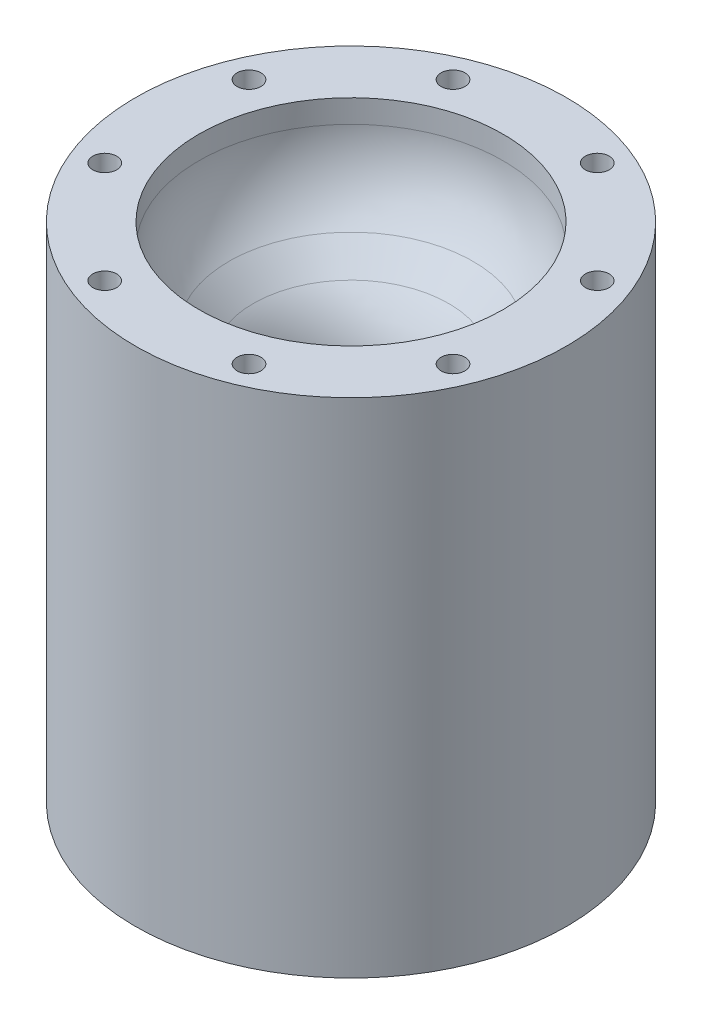
ISO-10303-21;
HEADER;
FILE_DESCRIPTION(('STEP AP214'),'2;1');
FILE_NAME('part.step','',(''),(''),'','','');
FILE_SCHEMA(('AUTOMOTIVE_DESIGN { 1 0 10303 214 1 1 1 1 }'));
ENDSEC;
DATA;
#1=APPLICATION_CONTEXT('core data for automotive mechanical design processes');
#2=APPLICATION_PROTOCOL_DEFINITION('international standard','automotive_design',2000,#1);
#3=PRODUCT_CONTEXT('',#1,'mechanical');
#4=PRODUCT('Part','Part','',(#3));
#5=PRODUCT_RELATED_PRODUCT_CATEGORY('part','',(#4));
#6=PRODUCT_DEFINITION_FORMATION('','',#4);
#7=PRODUCT_DEFINITION_CONTEXT('part definition',#1,'design');
#8=PRODUCT_DEFINITION('design','',#6,#7);
#9=PRODUCT_DEFINITION_SHAPE('','',#8);
#10=(LENGTH_UNIT() NAMED_UNIT(*) SI_UNIT(.MILLI.,.METRE.));
#11=(NAMED_UNIT(*) PLANE_ANGLE_UNIT() SI_UNIT($,.RADIAN.));
#12=(NAMED_UNIT(*) SI_UNIT($,.STERADIAN.) SOLID_ANGLE_UNIT());
#13=UNCERTAINTY_MEASURE_WITH_UNIT(LENGTH_MEASURE(1.E-05),#10,'distance_accuracy_value','');
#14=(GEOMETRIC_REPRESENTATION_CONTEXT(3) GLOBAL_UNCERTAINTY_ASSIGNED_CONTEXT((#13)) GLOBAL_UNIT_ASSIGNED_CONTEXT((#10,
#11,#12)) REPRESENTATION_CONTEXT('',''));
#15=CARTESIAN_POINT('',(0.,0.,0.));
#16=DIRECTION('',(0.,0.,1.));
#17=DIRECTION('',(1.,0.,0.));
#18=AXIS2_PLACEMENT_3D('',#15,#16,#17);
#19=CARTESIAN_POINT('',(-105.474898553049,0.,22.1235140794585));
#20=DIRECTION('',(0.,1.,0.));
#21=DIRECTION('',(-0.546944138603989,0.,0.837169104331222));
#22=AXIS2_PLACEMENT_3D('',#19,#20,#21);
#23=PLANE('',#22);
#24=CARTESIAN_POINT('',(25.5154178529435,0.,61.5996678301896));
#25=DIRECTION('',(0.,1.,0.));
#26=DIRECTION('',(0.,0.,1.));
#27=AXIS2_PLACEMENT_3D('',#24,#25,#26);
#28=CIRCLE('',#27,4.21639999999999);
#29=CARTESIAN_POINT('',(25.5154178529435,0.,65.8160678301896));
#30=VERTEX_POINT('',#29);
#31=EDGE_CURVE('E85',#30,#30,#28,.T.);
#32=ORIENTED_EDGE('',*,*,#31,.F.);
#33=EDGE_LOOP('',(#32));
#34=FACE_BOUND('',#33,.T.);
#35=CARTESIAN_POINT('',(-25.5154178529413,0.,61.5996678301905));
#36=DIRECTION('',(0.,1.,0.));
#37=DIRECTION('',(0.,0.,1.));
#38=AXIS2_PLACEMENT_3D('',#35,#36,#37);
#39=CIRCLE('',#38,4.21639999999999);
#40=CARTESIAN_POINT('',(-25.5154178529413,0.,65.8160678301905));
#41=VERTEX_POINT('',#40);
#42=EDGE_CURVE('E84',#41,#41,#39,.T.);
#43=ORIENTED_EDGE('',*,*,#42,.F.);
#44=EDGE_LOOP('',(#43));
#45=FACE_BOUND('',#44,.T.);
#46=CARTESIAN_POINT('',(-61.5996678301897,0.,25.5154178529433));
#47=DIRECTION('',(0.,1.,0.));
#48=DIRECTION('',(0.,0.,1.));
#49=AXIS2_PLACEMENT_3D('',#46,#47,#48);
#50=CIRCLE('',#49,4.21639999999999);
#51=CARTESIAN_POINT('',(-61.5996678301897,0.,29.7318178529433));
#52=VERTEX_POINT('',#51);
#53=EDGE_CURVE('E95',#52,#52,#50,.T.);
#54=ORIENTED_EDGE('',*,*,#53,.F.);
#55=EDGE_LOOP('',(#54));
#56=FACE_BOUND('',#55,.T.);
#57=CARTESIAN_POINT('',(-61.5996678301902,0.,-25.515417852942));
#58=DIRECTION('',(0.,1.,0.));
#59=DIRECTION('',(0.,0.,1.));
#60=AXIS2_PLACEMENT_3D('',#57,#58,#59);
#61=CIRCLE('',#60,4.21639999999999);
#62=CARTESIAN_POINT('',(-61.5996678301902,0.,-21.299017852942));
#63=VERTEX_POINT('',#62);
#64=EDGE_CURVE('E101',#63,#63,#61,.T.);
#65=ORIENTED_EDGE('',*,*,#64,.F.);
#66=EDGE_LOOP('',(#65));
#67=FACE_BOUND('',#66,.T.);
#68=CARTESIAN_POINT('',(-25.5154178529431,0.,-61.5996678301897));
#69=DIRECTION('',(0.,1.,0.));
#70=DIRECTION('',(0.,0.,1.));
#71=AXIS2_PLACEMENT_3D('',#68,#69,#70);
#72=CIRCLE('',#71,4.21639999999999);
#73=CARTESIAN_POINT('',(-25.5154178529431,0.,-57.3832678301897));
#74=VERTEX_POINT('',#73);
#75=EDGE_CURVE('E107',#74,#74,#72,.T.);
#76=ORIENTED_EDGE('',*,*,#75,.F.);
#77=EDGE_LOOP('',(#76));
#78=FACE_BOUND('',#77,.T.);
#79=CARTESIAN_POINT('',(25.5154178529418,0.,-61.5996678301903));
#80=DIRECTION('',(0.,1.,0.));
#81=DIRECTION('',(0.,0.,1.));
#82=AXIS2_PLACEMENT_3D('',#79,#80,#81);
#83=CIRCLE('',#82,4.21639999999999);
#84=CARTESIAN_POINT('',(25.5154178529418,0.,-57.3832678301903));
#85=VERTEX_POINT('',#84);
#86=EDGE_CURVE('E113',#85,#85,#83,.T.);
#87=ORIENTED_EDGE('',*,*,#86,.F.);
#88=EDGE_LOOP('',(#87));
#89=FACE_BOUND('',#88,.T.);
#90=CARTESIAN_POINT('',(61.5996678301898,0.,-25.5154178529429));
#91=DIRECTION('',(0.,1.,0.));
#92=DIRECTION('',(0.,0.,1.));
#93=AXIS2_PLACEMENT_3D('',#90,#91,#92);
#94=CIRCLE('',#93,4.21639999999999);
#95=CARTESIAN_POINT('',(61.5996678301898,0.,-21.2990178529429));
#96=VERTEX_POINT('',#95);
#97=EDGE_CURVE('E119',#96,#96,#94,.T.);
#98=ORIENTED_EDGE('',*,*,#97,.F.);
#99=EDGE_LOOP('',(#98));
#100=FACE_BOUND('',#99,.T.);
#101=CARTESIAN_POINT('',(61.5996678301902,0.,25.515417852942));
#102=DIRECTION('',(0.,1.,0.));
#103=DIRECTION('',(0.,0.,1.));
#104=AXIS2_PLACEMENT_3D('',#101,#102,#103);
#105=CIRCLE('',#104,4.21639999999999);
#106=CARTESIAN_POINT('',(61.5996678301902,0.,29.731817852942));
#107=VERTEX_POINT('',#106);
#108=EDGE_CURVE('E125',#107,#107,#105,.T.);
#109=ORIENTED_EDGE('',*,*,#108,.F.);
#110=EDGE_LOOP('',(#109));
#111=FACE_BOUND('',#110,.T.);
#112=CARTESIAN_POINT('',(0.,0.,0.));
#113=DIRECTION('',(0.,1.,0.));
#114=DIRECTION('',(-0.546944138603989,0.,0.837169104331222));
#115=AXIS2_PLACEMENT_3D('',#112,#113,#114);
#116=CIRCLE('',#115,53.7924602426016);
#117=CARTESIAN_POINT('',(-29.421470830779,0.,45.0333857610717));
#118=VERTEX_POINT('',#117);
#119=EDGE_CURVE('E135',#118,#118,#116,.F.);
#120=ORIENTED_EDGE('',*,*,#119,.T.);
#121=EDGE_LOOP('',(#120));
#122=FACE_BOUND('',#121,.T.);
#123=CARTESIAN_POINT('',(0.,0.,0.));
#124=DIRECTION('',(0.,1.,0.));
#125=DIRECTION('',(-0.546944138603989,0.,0.837169104331222));
#126=AXIS2_PLACEMENT_3D('',#123,#124,#125);
#127=CIRCLE('',#126,76.2);
#128=CARTESIAN_POINT('',(-41.6771433616239,0.,63.7922857500391));
#129=VERTEX_POINT('',#128);
#130=EDGE_CURVE('E43',#129,#129,#127,.T.);
#131=ORIENTED_EDGE('',*,*,#130,.T.);
#132=EDGE_LOOP('',(#131));
#133=FACE_BOUND('',#132,.T.);
#134=ADVANCED_FACE('F39',(#34,#45,#56,#67,#78,#89,#100,#111,#122,#133),#23,.T.);
#135=CARTESIAN_POINT('',(0.,-67.8726529233654,0.));
#136=DIRECTION('',(0.,-1.,0.));
#137=DIRECTION('',(0.546944138603989,0.,-0.837169104331222));
#138=AXIS2_PLACEMENT_3D('',#135,#136,#137);
#139=CYLINDRICAL_SURFACE('',#138,53.7924602426016);
#140=CARTESIAN_POINT('',(0.,-8.14497921746751,0.));
#141=DIRECTION('',(0.,-1.,0.));
#142=DIRECTION('',(0.546944138603989,0.,-0.837169104331222));
#143=AXIS2_PLACEMENT_3D('',#140,#141,#142);
#144=CIRCLE('',#143,53.7924602426016);
#145=CARTESIAN_POINT('',(29.421470830779,-8.14497921746751,-45.0333857610717));
#146=VERTEX_POINT('',#145);
#147=EDGE_CURVE('E141',#146,#146,#144,.T.);
#148=ORIENTED_EDGE('',*,*,#147,.T.);
#149=EDGE_LOOP('',(#148));
#150=FACE_BOUND('',#149,.T.);
#151=ORIENTED_EDGE('',*,*,#119,.F.);
#152=EDGE_LOOP('',(#151));
#153=FACE_BOUND('',#152,.T.);
#154=ADVANCED_FACE('F41',(#150,#153),#139,.F.);
#155=CARTESIAN_POINT('',(0.,-67.8726529233654,0.));
#156=DIRECTION('',(0.,-1.,0.));
#157=DIRECTION('',(0.546944138603989,0.,-0.837169104331222));
#158=AXIS2_PLACEMENT_3D('',#155,#156,#157);
#159=CYLINDRICAL_SURFACE('',#158,76.2);
#160=CARTESIAN_POINT('',(0.,-177.8,0.));
#161=DIRECTION('',(0.,-1.,0.));
#162=DIRECTION('',(0.546944138603989,0.,-0.837169104331222));
#163=AXIS2_PLACEMENT_3D('',#160,#161,#162);
#164=CIRCLE('',#163,76.2);
#165=CARTESIAN_POINT('',(41.6771433616239,-177.8,-63.7922857500391));
#166=VERTEX_POINT('',#165);
#167=EDGE_CURVE('E144',#166,#166,#164,.T.);
#168=ORIENTED_EDGE('',*,*,#167,.F.);
#169=EDGE_LOOP('',(#168));
#170=FACE_BOUND('',#169,.T.);
#171=ORIENTED_EDGE('',*,*,#130,.F.);
#172=EDGE_LOOP('',(#171));
#173=FACE_BOUND('',#172,.T.);
#174=ADVANCED_FACE('F171',(#170,#173),#159,.T.);
#175=CARTESIAN_POINT('',(22.3576150181326,-74.3818925737037,14.6068057505548));
#176=CARTESIAN_POINT('',(22.3151212001886,-74.3311317646138,14.5790434447899));
#177=CARTESIAN_POINT('',(22.2531052276855,-74.2547747023861,14.5385268126245));
#178=CARTESIAN_POINT('',(22.1142299052263,-74.081294569482,14.4477959874868));
#179=CARTESIAN_POINT('',(21.9985251885419,-73.9226045599318,14.372203115901));
#180=CARTESIAN_POINT('',(21.8415816142479,-73.7055665706629,14.2696678364603));
#181=CARTESIAN_POINT('',(21.6955199673253,-73.4833804661312,14.1742420004544));
#182=CARTESIAN_POINT('',(21.5175234127509,-73.198171859299,14.0579522667405));
#183=CARTESIAN_POINT('',(21.3590694452682,-72.9183567845891,13.9544302085269));
#184=CARTESIAN_POINT('',(21.2033340442785,-72.6239544988483,13.8526842598245));
#185=CARTESIAN_POINT('',(21.0606165679029,-72.327436046122,13.7594432565719));
#186=CARTESIAN_POINT('',(20.9250437941573,-72.0219351077,13.6708700715716));
#187=CARTESIAN_POINT('',(20.8004861551113,-71.7123196560876,13.5894933577845));
#188=CARTESIAN_POINT('',(20.6848821385096,-71.3962800805611,13.5139662761563));
#189=CARTESIAN_POINT('',(20.5797523673591,-71.0759999643649,13.4452822888639));
#190=CARTESIAN_POINT('',(20.484417510876,-70.7507455680926,13.3829975716086));
#191=CARTESIAN_POINT('',(20.3995136270642,-70.4218923440607,13.3275276774674));
#192=CARTESIAN_POINT('',(20.3248532371523,-70.0890073433412,13.2787501217299));
#193=CARTESIAN_POINT('',(20.2607278419163,-69.7536497003092,13.2368553493613));
#194=CARTESIAN_POINT('',(20.2071118522122,-69.414703421174,13.2018266423147));
#195=CARTESIAN_POINT('',(20.1641528657746,-69.075190196234,13.1737604299917));
#196=CARTESIAN_POINT('',(20.1358987167878,-68.7740862512058,13.1553012667239));
#197=CARTESIAN_POINT('',(20.1184006365342,-68.519417189635,13.1438693202008));
#198=CARTESIAN_POINT('',(20.1082943052423,-68.2997170404591,13.1372665936617));
#199=CARTESIAN_POINT('',(20.10290474022,-68.1402939927496,13.133745452015));
#200=CARTESIAN_POINT('',(20.1008809748885,-67.9827666128845,13.1324232739983));
#201=CARTESIAN_POINT('',(20.1004307194324,-67.9085455755414,13.1321291105118));
#202=CARTESIAN_POINT('',(20.1004301949926,-67.8726529233655,13.1321287678818));
#203=B_SPLINE_CURVE_WITH_KNOTS('',4,(#175,#176,#177,#178,#179,#180,#181,#182,#183,#184,#185,
#186,#187,#188,#189,#190,#191,#192,#193,#194,#195,#196,#197,#198,#199,#200,#201,#202),
.UNSPECIFIED.,.F.,.F.,(5,1,1,1,1,1,1,1,1,1,1,1,1,1,1,1,1,1,1,1,1,1,1,1,5),(0.0825688161645696,
0.122284452541055,0.142142270729318,0.162000088917581,0.201715725294151,0.241431361670644,
0.281146998047181,0.320862634423759,0.360578270800262,0.400293907176806,0.440009543553384,
0.479725179929891,0.519440816306429,0.55915645268299,0.598872089059496,0.638587725436031,
0.678303361812587,0.718018998189109,0.75773463456565,0.797450270942201,0.837165907318734,
0.857023725507005,0.876881543695275,0.896739361883545,0.916597180071815),.UNSPECIFIED.);
#204=CARTESIAN_POINT('',(0.,-67.8726529233654,0.));
#205=DIRECTION('',(0.,-1.,0.));
#206=AXIS1_PLACEMENT('',#204,#205);
#207=SURFACE_OF_REVOLUTION('',#203,#206);
#208=CARTESIAN_POINT('',(0.,-67.8726529186409,0.));
#209=DIRECTION('',(0.,-1.,0.));
#210=DIRECTION('',(0.546944138603989,0.,-0.837169104331222));
#211=AXIS2_PLACEMENT_3D('',#208,#209,#210);
#212=CIRCLE('',#211,24.0100000000001);
#213=CARTESIAN_POINT('',(13.1321287678818,-67.8726529186409,-20.1004301949927));
#214=VERTEX_POINT('',#213);
#215=EDGE_CURVE('E131',#214,#214,#212,.T.);
#216=ORIENTED_EDGE('',*,*,#215,.F.);
#217=EDGE_LOOP('',(#216));
#218=FACE_BOUND('',#217,.T.);
#219=CARTESIAN_POINT('',(0.,-74.3818925737037,0.));
#220=DIRECTION('',(0.,-1.,0.));
#221=DIRECTION('',(0.546944138603989,0.,-0.837169104331222));
#222=AXIS2_PLACEMENT_3D('',#219,#220,#221);
#223=CIRCLE('',#222,26.7062113287053);
#224=CARTESIAN_POINT('',(14.6068057505548,-74.3818925737037,-22.3576150181326));
#225=VERTEX_POINT('',#224);
#226=EDGE_CURVE('E11',#225,#225,#223,.T.);
#227=ORIENTED_EDGE('',*,*,#226,.T.);
#228=EDGE_LOOP('',(#227));
#229=FACE_BOUND('',#228,.T.);
#230=ADVANCED_FACE('F173',(#218,#229),#207,.T.);
#231=CARTESIAN_POINT('',(20.1004301949927,-67.8726529186409,13.1321287678818));
#232=CARTESIAN_POINT('',(20.1004312254771,-67.8021242760988,13.1321294411238));
#233=CARTESIAN_POINT('',(20.1008742114858,-67.6590687334712,13.1324188552931));
#234=CARTESIAN_POINT('',(20.1028630625336,-67.3294700072802,13.133718222909));
#235=CARTESIAN_POINT('',(20.1081576506364,-67.0484925265606,13.1371773136879));
#236=CARTESIAN_POINT('',(20.1160983018644,-66.6778308516662,13.1423651456604));
#237=CARTESIAN_POINT('',(20.1266820395964,-66.3592178650873,13.1492797741233));
#238=CARTESIAN_POINT('',(20.1399094997414,-66.0107133201954,13.1579216145322));
#239=CARTESIAN_POINT('',(20.1557782573347,-65.6789460516852,13.1682890825953));
#240=CARTESIAN_POINT('',(20.178915615045,-65.254583523584,13.1834053143303));
#241=CARTESIAN_POINT('',(20.2119571795456,-64.750618976727,13.2049922194614));
#242=CARTESIAN_POINT('',(20.2714067866383,-63.9926742486808,13.243832179003));
#243=CARTESIAN_POINT('',(20.3717222273905,-62.9862025355214,13.3093708402448));
#244=CARTESIAN_POINT('',(20.5193648430517,-61.8159421635176,13.4058295638483));
#245=CARTESIAN_POINT('',(20.7298284807685,-60.4874865093139,13.5433308792252));
#246=CARTESIAN_POINT('',(20.9817411069935,-59.1690784099242,13.7079118863853));
#247=CARTESIAN_POINT('',(21.2747296275626,-57.8630157161931,13.8993288333013));
#248=CARTESIAN_POINT('',(21.6084171660008,-56.5708333285718,14.1173354968651));
#249=CARTESIAN_POINT('',(21.9822838387625,-55.2945535908105,14.3615922237659));
#250=CARTESIAN_POINT('',(22.3958938779079,-54.0357654423022,14.6318143155845));
#251=CARTESIAN_POINT('',(22.8485259329291,-52.7964557981062,14.9275304954547));
#252=CARTESIAN_POINT('',(23.3397820114652,-51.5780431337703,15.2484807447159));
#253=CARTESIAN_POINT('',(23.8685882605895,-50.3827141343478,15.5939634875923));
#254=CARTESIAN_POINT('',(24.4348435844443,-49.2113651719956,15.963912675556));
#255=CARTESIAN_POINT('',(25.0366950938936,-48.0669095333356,16.3571177684103));
#256=CARTESIAN_POINT('',(25.675100915406,-46.9487928559064,16.7742047348551));
#257=CARTESIAN_POINT('',(26.2620780115252,-45.9982411711718,17.1576919903645));
#258=CARTESIAN_POINT('',(26.7891336713676,-45.1992074516618,17.5020310281735));
#259=CARTESIAN_POINT('',(27.2373475599466,-44.5522307944854,17.7948607061094));
#260=CARTESIAN_POINT('',(27.6125059350549,-44.032647916699,18.0399613354232));
#261=CARTESIAN_POINT('',(27.9776742927726,-43.5428366874424,18.2785352290655));
#262=CARTESIAN_POINT('',(28.3354603568983,-43.084168544351,18.5122860801604));
#263=CARTESIAN_POINT('',(28.5947588528579,-42.7587846242642,18.6816924662539));
#264=CARTESIAN_POINT('',(28.8386273170148,-42.4630038879591,18.8410180151435));
#265=CARTESIAN_POINT('',(28.9219695677308,-42.3627030027853,18.8954676541607));
#266=CARTESIAN_POINT('',(28.9637195073119,-42.312830817846,18.9227439650312));
#267=B_SPLINE_CURVE_WITH_KNOTS('',4,(#231,#232,#233,#234,#235,#236,#237,#238,#239,#240,#241,
#242,#243,#244,#245,#246,#247,#248,#249,#250,#251,#252,#253,#254,#255,#256,#257,#258,#259,#260,
#261,#262,#263,#264,#265,#266),.UNSPECIFIED.,.F.,.F.,(5,1,1,1,1,1,1,1,1,1,1,1,1,1,1,1,1,1,1,1,1,
1,1,1,1,1,1,1,1,1,1,1,5),(0.0826377293508924,0.0925749264345495,0.10251212335078,
0.11244932026701,0.122386517183241,0.132323714099471,0.142260911015702,0.152198107931932,
0.162135304848163,0.182009698680624,0.201884092513085,0.241632880178006,0.281381667842927,
0.321130455507848,0.360879243172768,0.400628030837689,0.44037681850261,0.480125606167531,
0.519874393832452,0.559623181497373,0.599371969162294,0.639120756827214,0.678869544492136,
0.718618332157059,0.758367119821983,0.798115907486907,0.817990301319368,0.837864695151829,
0.857739088984291,0.877613482816753,0.897487876649217,0.907425073565449,0.917362270311961),.UNSPECIFIED.);
#268=CARTESIAN_POINT('',(0.,-67.8726529233654,0.));
#269=DIRECTION('',(0.,-1.,0.));
#270=AXIS1_PLACEMENT('',#268,#269);
#271=SURFACE_OF_REVOLUTION('',#267,#270);
#272=CARTESIAN_POINT('',(0.,-42.3128308211773,0.));
#273=DIRECTION('',(0.,-1.,0.));
#274=DIRECTION('',(0.546944138603989,0.,-0.837169104331222));
#275=AXIS2_PLACEMENT_3D('',#272,#273,#274);
#276=CIRCLE('',#275,34.5972150126512);
#277=CARTESIAN_POINT('',(18.9227439631915,-42.3128308211773,-28.9637195044959));
#278=VERTEX_POINT('',#277);
#279=EDGE_CURVE('E134',#278,#278,#276,.T.);
#280=ORIENTED_EDGE('',*,*,#279,.F.);
#281=EDGE_LOOP('',(#280));
#282=FACE_BOUND('',#281,.T.);
#283=ORIENTED_EDGE('',*,*,#215,.T.);
#284=EDGE_LOOP('',(#283));
#285=FACE_BOUND('',#284,.T.);
#286=ADVANCED_FACE('F179',(#282,#285),#271,.T.);
#287=CARTESIAN_POINT('',(0.,-42.3128308211773,0.));
#288=DIRECTION('',(0.,1.,0.));
#289=DIRECTION('',(-0.546944138603989,0.,0.837169104331222));
#290=AXIS2_PLACEMENT_3D('',#287,#288,#289);
#291=CONICAL_SURFACE('',#290,34.5972150126512,0.785398163436918);
#292=CARTESIAN_POINT('',(0.,-33.7052026337569,0.));
#293=DIRECTION('',(0.,-1.,0.));
#294=DIRECTION('',(0.546944138603989,0.,-0.837169104331222));
#295=AXIS2_PLACEMENT_3D('',#292,#293,#294);
#296=CIRCLE('',#295,43.2048432007511);
#297=CARTESIAN_POINT('',(23.6306357479552,-33.7052026337569,-36.1697598851437));
#298=VERTEX_POINT('',#297);
#299=EDGE_CURVE('E138',#298,#298,#296,.T.);
#300=ORIENTED_EDGE('',*,*,#299,.F.);
#301=EDGE_LOOP('',(#300));
#302=FACE_BOUND('',#301,.T.);
#303=ORIENTED_EDGE('',*,*,#279,.T.);
#304=EDGE_LOOP('',(#303));
#305=FACE_BOUND('',#304,.T.);
#306=ADVANCED_FACE('F206',(#302,#305),#291,.F.);
#307=CARTESIAN_POINT('',(36.1697598851437,-33.7052026337569,23.6306357479552));
#308=CARTESIAN_POINT('',(36.2115113164484,-33.6553302357281,23.6579130334072));
#309=CARTESIAN_POINT('',(36.2957379983243,-33.5539760047141,23.7129404940812));
#310=CARTESIAN_POINT('',(36.4880192805099,-33.3209428448882,23.8385628082715));
#311=CARTESIAN_POINT('',(36.6553293851741,-33.1121521474801,23.947870809011));
#312=CARTESIAN_POINT('',(36.912786413702,-32.7878611179685,24.1160741170012));
#313=CARTESIAN_POINT('',(37.1918305246546,-32.4254996507945,24.2983808219523));
#314=CARTESIAN_POINT('',(37.5269918159564,-31.9782446811994,24.517350326221));
#315=CARTESIAN_POINT('',(37.8934129805481,-31.4691110381062,24.7567427108623));
#316=CARTESIAN_POINT('',(38.3460872815335,-30.8168202055752,25.0524864911089));
#317=CARTESIAN_POINT('',(38.8704323565649,-30.021040552137,25.3950546340451));
#318=CARTESIAN_POINT('',(39.4591573739396,-29.0684161083598,25.7796838515314));
#319=CARTESIAN_POINT('',(40.0965556595241,-27.9515197014156,26.1961125688038));
#320=CARTESIAN_POINT('',(40.6990241759653,-26.8063374901098,26.5897207682179));
#321=CARTESIAN_POINT('',(41.2649463203899,-25.635399139947,26.9594522814783));
#322=CARTESIAN_POINT('',(41.7939875624346,-24.439790862229,27.3050885512822));
#323=CARTESIAN_POINT('',(42.2851319406022,-23.2215235930892,27.6259658238156));
#324=CARTESIAN_POINT('',(42.7378617962801,-21.9820839991571,27.9217458993738));
#325=CARTESIAN_POINT('',(43.1514379745436,-20.7233573446488,28.1919458690062));
#326=CARTESIAN_POINT('',(43.4786128062074,-19.6065231937962,28.4056976134882));
#327=CARTESIAN_POINT('',(43.7338996678895,-18.6394146816749,28.5724830955816));
#328=CARTESIAN_POINT('',(43.9689138795066,-17.6650033877727,28.7260239332303));
#329=CARTESIAN_POINT('',(44.1835313131354,-16.6839533463177,28.8662390304648));
#330=CARTESIAN_POINT('',(44.3724712389804,-15.6950496116773,28.9896783504953));
#331=CARTESIAN_POINT('',(44.5355071173688,-14.700067196054,29.0961938891187));
#332=CARTESIAN_POINT('',(44.6777128294519,-13.7000570080899,29.1891005435777));
#333=CARTESIAN_POINT('',(44.7788019090098,-12.8643265797087,29.2551446429777));
#334=CARTESIAN_POINT('',(44.8624029574195,-12.024012075744,29.309763361194));
#335=CARTESIAN_POINT('',(44.9284595193324,-11.1844942775343,29.3529198144932));
#336=CARTESIAN_POINT('',(44.9654725836544,-10.5915325442142,29.3771014027505));
#337=CARTESIAN_POINT('',(44.9905979943656,-10.0908980011361,29.3935164807167));
#338=CARTESIAN_POINT('',(45.0071327824356,-9.65965482234239,29.4043190836451));
#339=CARTESIAN_POINT('',(45.0177170295639,-9.33992495659441,29.4112340449096));
#340=CARTESIAN_POINT('',(45.0256579908264,-8.967696951742,29.4164220794357));
#341=CARTESIAN_POINT('',(45.0309527529677,-8.69092782805737,29.4198812839184));
#342=CARTESIAN_POINT('',(45.0329417454924,-8.35708634162131,29.4211807439647));
#343=CARTESIAN_POINT('',(45.0333847293643,-8.2155092879735,29.4214701567381));
#344=CARTESIAN_POINT('',(45.0333857610714,-8.1449792347959,29.4214708307789));
#345=B_SPLINE_CURVE_WITH_KNOTS('',4,(#307,#308,#309,#310,#311,#312,#313,#314,#315,#316,#317,
#318,#319,#320,#321,#322,#323,#324,#325,#326,#327,#328,#329,#330,#331,#332,#333,#334,#335,#336,
#337,#338,#339,#340,#341,#342,#343,#344),.UNSPECIFIED.,.F.,.F.,(5,1,1,1,1,1,1,1,1,1,1,1,1,1,1,1,
1,1,1,1,1,1,1,1,1,1,1,1,1,1,1,1,1,1,5),(0.0826377289041388,0.0925749252106824,0.102512122126915,
0.112449319043147,0.122386515959379,0.14226090979184,0.162135303624301,0.182009697456762,
0.201884091289222,0.241632878954144,0.281381666619066,0.321130454283987,0.360879241948909,
0.400628029613831,0.440376817278752,0.480125604943674,0.519874392608595,0.559623180273516,
0.599371967938437,0.619246361770898,0.639120755603359,0.678869543268281,0.718618330933202,
0.738492724765663,0.758367118598124,0.798115906263045,0.817990300095506,0.837864693927966,
0.857739087760428,0.867676284676658,0.877613481592889,0.887550678509119,0.897487875425349,
0.90742507234158,0.917362269871989),.UNSPECIFIED.);
#346=CARTESIAN_POINT('',(0.,-67.8726529233654,0.));
#347=DIRECTION('',(0.,-1.,0.));
#348=AXIS1_PLACEMENT('',#346,#347);
#349=SURFACE_OF_REVOLUTION('',#345,#348);
#350=ORIENTED_EDGE('',*,*,#147,.F.);
#351=EDGE_LOOP('',(#350));
#352=FACE_BOUND('',#351,.T.);
#353=ORIENTED_EDGE('',*,*,#299,.T.);
#354=EDGE_LOOP('',(#353));
#355=FACE_BOUND('',#354,.T.);
#356=ADVANCED_FACE('F209',(#352,#355),#349,.T.);
#357=CARTESIAN_POINT('',(59.9735016088269,-177.8,39.1822333227514));
#358=DIRECTION('',(0.,1.,0.));
#359=DIRECTION('',(-0.546944138603989,0.,0.837169104331222));
#360=AXIS2_PLACEMENT_3D('',#357,#358,#359);
#361=PLANE('',#360);
#362=CARTESIAN_POINT('',(0.,-177.8,0.));
#363=DIRECTION('',(0.,-1.,0.));
#364=DIRECTION('',(0.546944138603989,0.,-0.837169104331222));
#365=AXIS2_PLACEMENT_3D('',#362,#363,#364);
#366=CIRCLE('',#365,71.6384554787615);
#367=CARTESIAN_POINT('',(39.1822333227514,-177.8,-59.9735016088269));
#368=VERTEX_POINT('',#367);
#369=EDGE_CURVE('E48',#368,#368,#366,.T.);
#370=ORIENTED_EDGE('',*,*,#369,.F.);
#371=EDGE_LOOP('',(#370));
#372=FACE_BOUND('',#371,.T.);
#373=ORIENTED_EDGE('',*,*,#167,.T.);
#374=EDGE_LOOP('',(#373));
#375=FACE_BOUND('',#374,.T.);
#376=ADVANCED_FACE('F166',(#372,#375),#361,.F.);
#377=CARTESIAN_POINT('',(59.9735016088269,-177.8,39.1822333227514));
#378=CARTESIAN_POINT('',(41.1655583611938,-102.508607147064,26.8945195678259));
#379=CARTESIAN_POINT('',(22.3576150181326,-74.3818925737037,14.6068057505548));
#380=B_SPLINE_CURVE_WITH_KNOTS('',2,(#377,#378,#379),.UNSPECIFIED.,.F.,.F.,(3,3),(0.,1.),.UNSPECIFIED.);
#381=CARTESIAN_POINT('',(0.,-67.8726529233654,0.));
#382=DIRECTION('',(0.,-1.,0.));
#383=AXIS1_PLACEMENT('',#381,#382);
#384=SURFACE_OF_REVOLUTION('',#380,#383);
#385=ORIENTED_EDGE('',*,*,#226,.F.);
#386=EDGE_LOOP('',(#385));
#387=FACE_BOUND('',#386,.T.);
#388=ORIENTED_EDGE('',*,*,#369,.T.);
#389=EDGE_LOOP('',(#388));
#390=FACE_BOUND('',#389,.T.);
#391=ADVANCED_FACE('F161',(#387,#390),#384,.T.);
#392=CARTESIAN_POINT('',(61.5996678301902,-22.22754,25.515417852942));
#393=DIRECTION('',(0.,1.,0.));
#394=DIRECTION('',(0.,0.,1.));
#395=AXIS2_PLACEMENT_3D('',#392,#393,#394);
#396=CONICAL_SURFACE('',#395,4.21639999999999,1.02974425867665);
#397=CARTESIAN_POINT('',(61.5996678301902,-24.7610087140678,25.515417852942));
#398=VERTEX_POINT('',#397);
#399=VERTEX_LOOP('',#398);
#400=FACE_BOUND('',#399,.T.);
#401=CARTESIAN_POINT('',(61.5996678301902,-22.22754,25.515417852942));
#402=DIRECTION('',(0.,1.,0.));
#403=DIRECTION('',(0.,0.,1.));
#404=AXIS2_PLACEMENT_3D('',#401,#402,#403);
#405=CIRCLE('',#404,4.21639999999999);
#406=CARTESIAN_POINT('',(61.5996678301902,-22.22754,29.731817852942));
#407=VERTEX_POINT('',#406);
#408=EDGE_CURVE('E128',#407,#407,#405,.T.);
#409=ORIENTED_EDGE('',*,*,#408,.T.);
#410=EDGE_LOOP('',(#409));
#411=FACE_BOUND('',#410,.T.);
#412=ADVANCED_FACE('F165',(#400,#411),#396,.F.);
#413=CARTESIAN_POINT('',(61.5996678301902,0.,25.515417852942));
#414=DIRECTION('',(0.,1.,0.));
#415=DIRECTION('',(0.,0.,1.));
#416=AXIS2_PLACEMENT_3D('',#413,#414,#415);
#417=CYLINDRICAL_SURFACE('',#416,4.21639999999999);
#418=ORIENTED_EDGE('',*,*,#408,.F.);
#419=EDGE_LOOP('',(#418));
#420=FACE_BOUND('',#419,.T.);
#421=ORIENTED_EDGE('',*,*,#108,.T.);
#422=EDGE_LOOP('',(#421));
#423=FACE_BOUND('',#422,.T.);
#424=ADVANCED_FACE('F242',(#420,#423),#417,.F.);
#425=CARTESIAN_POINT('',(61.5996678301898,-22.22754,-25.5154178529429));
#426=DIRECTION('',(0.,1.,0.));
#427=DIRECTION('',(0.,0.,1.));
#428=AXIS2_PLACEMENT_3D('',#425,#426,#427);
#429=CONICAL_SURFACE('',#428,4.21639999999998,1.02974425867665);
#430=CARTESIAN_POINT('',(61.5996678301898,-24.7610087140678,-25.5154178529429));
#431=VERTEX_POINT('',#430);
#432=VERTEX_LOOP('',#431);
#433=FACE_BOUND('',#432,.T.);
#434=CARTESIAN_POINT('',(61.5996678301898,-22.22754,-25.5154178529429));
#435=DIRECTION('',(0.,1.,0.));
#436=DIRECTION('',(0.,0.,1.));
#437=AXIS2_PLACEMENT_3D('',#434,#435,#436);
#438=CIRCLE('',#437,4.21639999999998);
#439=CARTESIAN_POINT('',(61.5996678301898,-22.22754,-21.2990178529429));
#440=VERTEX_POINT('',#439);
#441=EDGE_CURVE('E122',#440,#440,#438,.T.);
#442=ORIENTED_EDGE('',*,*,#441,.T.);
#443=EDGE_LOOP('',(#442));
#444=FACE_BOUND('',#443,.T.);
#445=ADVANCED_FACE('F249',(#433,#444),#429,.F.);
#446=CARTESIAN_POINT('',(61.5996678301898,0.,-25.5154178529429));
#447=DIRECTION('',(0.,1.,0.));
#448=DIRECTION('',(0.,0.,1.));
#449=AXIS2_PLACEMENT_3D('',#446,#447,#448);
#450=CYLINDRICAL_SURFACE('',#449,4.21639999999999);
#451=ORIENTED_EDGE('',*,*,#441,.F.);
#452=EDGE_LOOP('',(#451));
#453=FACE_BOUND('',#452,.T.);
#454=ORIENTED_EDGE('',*,*,#97,.T.);
#455=EDGE_LOOP('',(#454));
#456=FACE_BOUND('',#455,.T.);
#457=ADVANCED_FACE('F258',(#453,#456),#450,.F.);
#458=CARTESIAN_POINT('',(25.5154178529418,-22.22754,-61.5996678301903));
#459=DIRECTION('',(0.,1.,0.));
#460=DIRECTION('',(0.,0.,1.));
#461=AXIS2_PLACEMENT_3D('',#458,#459,#460);
#462=CONICAL_SURFACE('',#461,4.21639999999999,1.02974425867665);
#463=CARTESIAN_POINT('',(25.5154178529417,-24.7610087140678,-61.5996678301903));
#464=VERTEX_POINT('',#463);
#465=VERTEX_LOOP('',#464);
#466=FACE_BOUND('',#465,.T.);
#467=CARTESIAN_POINT('',(25.5154178529418,-22.22754,-61.5996678301903));
#468=DIRECTION('',(0.,1.,0.));
#469=DIRECTION('',(0.,0.,1.));
#470=AXIS2_PLACEMENT_3D('',#467,#468,#469);
#471=CIRCLE('',#470,4.21639999999999);
#472=CARTESIAN_POINT('',(25.5154178529418,-22.22754,-57.3832678301903));
#473=VERTEX_POINT('',#472);
#474=EDGE_CURVE('E116',#473,#473,#471,.T.);
#475=ORIENTED_EDGE('',*,*,#474,.T.);
#476=EDGE_LOOP('',(#475));
#477=FACE_BOUND('',#476,.T.);
#478=ADVANCED_FACE('F267',(#466,#477),#462,.F.);
#479=CARTESIAN_POINT('',(25.5154178529418,0.,-61.5996678301903));
#480=DIRECTION('',(0.,1.,0.));
#481=DIRECTION('',(0.,0.,1.));
#482=AXIS2_PLACEMENT_3D('',#479,#480,#481);
#483=CYLINDRICAL_SURFACE('',#482,4.21639999999999);
#484=ORIENTED_EDGE('',*,*,#474,.F.);
#485=EDGE_LOOP('',(#484));
#486=FACE_BOUND('',#485,.T.);
#487=ORIENTED_EDGE('',*,*,#86,.T.);
#488=EDGE_LOOP('',(#487));
#489=FACE_BOUND('',#488,.T.);
#490=ADVANCED_FACE('F277',(#486,#489),#483,.F.);
#491=CARTESIAN_POINT('',(-25.5154178529431,-22.22754,-61.5996678301897));
#492=DIRECTION('',(0.,1.,0.));
#493=DIRECTION('',(0.,0.,1.));
#494=AXIS2_PLACEMENT_3D('',#491,#492,#493);
#495=CONICAL_SURFACE('',#494,4.21639999999999,1.02974425867665);
#496=CARTESIAN_POINT('',(-25.5154178529431,-24.7610087140678,-61.5996678301897));
#497=VERTEX_POINT('',#496);
#498=VERTEX_LOOP('',#497);
#499=FACE_BOUND('',#498,.T.);
#500=CARTESIAN_POINT('',(-25.5154178529431,-22.22754,-61.5996678301897));
#501=DIRECTION('',(0.,1.,0.));
#502=DIRECTION('',(0.,0.,1.));
#503=AXIS2_PLACEMENT_3D('',#500,#501,#502);
#504=CIRCLE('',#503,4.21639999999999);
#505=CARTESIAN_POINT('',(-25.5154178529431,-22.22754,-57.3832678301898));
#506=VERTEX_POINT('',#505);
#507=EDGE_CURVE('E110',#506,#506,#504,.T.);
#508=ORIENTED_EDGE('',*,*,#507,.T.);
#509=EDGE_LOOP('',(#508));
#510=FACE_BOUND('',#509,.T.);
#511=ADVANCED_FACE('F285',(#499,#510),#495,.F.);
#512=CARTESIAN_POINT('',(-25.5154178529431,0.,-61.5996678301897));
#513=DIRECTION('',(0.,1.,0.));
#514=DIRECTION('',(0.,0.,1.));
#515=AXIS2_PLACEMENT_3D('',#512,#513,#514);
#516=CYLINDRICAL_SURFACE('',#515,4.21639999999999);
#517=ORIENTED_EDGE('',*,*,#507,.F.);
#518=EDGE_LOOP('',(#517));
#519=FACE_BOUND('',#518,.T.);
#520=ORIENTED_EDGE('',*,*,#75,.T.);
#521=EDGE_LOOP('',(#520));
#522=FACE_BOUND('',#521,.T.);
#523=ADVANCED_FACE('F294',(#519,#522),#516,.F.);
#524=CARTESIAN_POINT('',(-61.5996678301902,-22.22754,-25.515417852942));
#525=DIRECTION('',(0.,1.,0.));
#526=DIRECTION('',(0.,0.,1.));
#527=AXIS2_PLACEMENT_3D('',#524,#525,#526);
#528=CONICAL_SURFACE('',#527,4.21639999999999,1.02974425867665);
#529=CARTESIAN_POINT('',(-61.5996678301902,-24.7610087140678,-25.515417852942));
#530=VERTEX_POINT('',#529);
#531=VERTEX_LOOP('',#530);
#532=FACE_BOUND('',#531,.T.);
#533=CARTESIAN_POINT('',(-61.5996678301902,-22.22754,-25.515417852942));
#534=DIRECTION('',(0.,1.,0.));
#535=DIRECTION('',(0.,0.,1.));
#536=AXIS2_PLACEMENT_3D('',#533,#534,#535);
#537=CIRCLE('',#536,4.21639999999999);
#538=CARTESIAN_POINT('',(-61.5996678301902,-22.22754,-21.299017852942));
#539=VERTEX_POINT('',#538);
#540=EDGE_CURVE('E104',#539,#539,#537,.T.);
#541=ORIENTED_EDGE('',*,*,#540,.T.);
#542=EDGE_LOOP('',(#541));
#543=FACE_BOUND('',#542,.T.);
#544=ADVANCED_FACE('F302',(#532,#543),#528,.F.);
#545=CARTESIAN_POINT('',(-61.5996678301902,0.,-25.515417852942));
#546=DIRECTION('',(0.,1.,0.));
#547=DIRECTION('',(0.,0.,1.));
#548=AXIS2_PLACEMENT_3D('',#545,#546,#547);
#549=CYLINDRICAL_SURFACE('',#548,4.21639999999999);
#550=ORIENTED_EDGE('',*,*,#540,.F.);
#551=EDGE_LOOP('',(#550));
#552=FACE_BOUND('',#551,.T.);
#553=ORIENTED_EDGE('',*,*,#64,.T.);
#554=EDGE_LOOP('',(#553));
#555=FACE_BOUND('',#554,.T.);
#556=ADVANCED_FACE('F311',(#552,#555),#549,.F.);
#557=CARTESIAN_POINT('',(-61.5996678301897,-22.22754,25.5154178529433));
#558=DIRECTION('',(0.,1.,0.));
#559=DIRECTION('',(0.,0.,1.));
#560=AXIS2_PLACEMENT_3D('',#557,#558,#559);
#561=CONICAL_SURFACE('',#560,4.21639999999999,1.02974425867665);
#562=CARTESIAN_POINT('',(-61.5996678301897,-24.7610087140678,25.5154178529433));
#563=VERTEX_POINT('',#562);
#564=VERTEX_LOOP('',#563);
#565=FACE_BOUND('',#564,.T.);
#566=CARTESIAN_POINT('',(-61.5996678301897,-22.22754,25.5154178529433));
#567=DIRECTION('',(0.,1.,0.));
#568=DIRECTION('',(0.,0.,1.));
#569=AXIS2_PLACEMENT_3D('',#566,#567,#568);
#570=CIRCLE('',#569,4.21639999999999);
#571=CARTESIAN_POINT('',(-61.5996678301897,-22.22754,29.7318178529433));
#572=VERTEX_POINT('',#571);
#573=EDGE_CURVE('E98',#572,#572,#570,.T.);
#574=ORIENTED_EDGE('',*,*,#573,.T.);
#575=EDGE_LOOP('',(#574));
#576=FACE_BOUND('',#575,.T.);
#577=ADVANCED_FACE('F319',(#565,#576),#561,.F.);
#578=CARTESIAN_POINT('',(-61.5996678301897,0.,25.5154178529433));
#579=DIRECTION('',(0.,1.,0.));
#580=DIRECTION('',(0.,0.,1.));
#581=AXIS2_PLACEMENT_3D('',#578,#579,#580);
#582=CYLINDRICAL_SURFACE('',#581,4.21639999999999);
#583=ORIENTED_EDGE('',*,*,#573,.F.);
#584=EDGE_LOOP('',(#583));
#585=FACE_BOUND('',#584,.T.);
#586=ORIENTED_EDGE('',*,*,#53,.T.);
#587=EDGE_LOOP('',(#586));
#588=FACE_BOUND('',#587,.T.);
#589=ADVANCED_FACE('F328',(#585,#588),#582,.F.);
#590=CARTESIAN_POINT('',(-25.5154178529413,-22.22754,61.5996678301905));
#591=DIRECTION('',(0.,1.,0.));
#592=DIRECTION('',(0.,0.,1.));
#593=AXIS2_PLACEMENT_3D('',#590,#591,#592);
#594=CONICAL_SURFACE('',#593,4.21639999999999,1.02974425867665);
#595=CARTESIAN_POINT('',(-25.5154178529413,-24.7610087140678,61.5996678301905));
#596=VERTEX_POINT('',#595);
#597=VERTEX_LOOP('',#596);
#598=FACE_BOUND('',#597,.T.);
#599=CARTESIAN_POINT('',(-25.5154178529413,-22.22754,61.5996678301905));
#600=DIRECTION('',(0.,1.,0.));
#601=DIRECTION('',(0.,0.,1.));
#602=AXIS2_PLACEMENT_3D('',#599,#600,#601);
#603=CIRCLE('',#602,4.21639999999999);
#604=CARTESIAN_POINT('',(-25.5154178529413,-22.22754,65.8160678301904));
#605=VERTEX_POINT('',#604);
#606=EDGE_CURVE('E88',#605,#605,#603,.T.);
#607=ORIENTED_EDGE('',*,*,#606,.T.);
#608=EDGE_LOOP('',(#607));
#609=FACE_BOUND('',#608,.T.);
#610=ADVANCED_FACE('F336',(#598,#609),#594,.F.);
#611=CARTESIAN_POINT('',(-25.5154178529413,0.,61.5996678301905));
#612=DIRECTION('',(0.,1.,0.));
#613=DIRECTION('',(0.,0.,1.));
#614=AXIS2_PLACEMENT_3D('',#611,#612,#613);
#615=CYLINDRICAL_SURFACE('',#614,4.21639999999999);
#616=ORIENTED_EDGE('',*,*,#606,.F.);
#617=EDGE_LOOP('',(#616));
#618=FACE_BOUND('',#617,.T.);
#619=ORIENTED_EDGE('',*,*,#42,.T.);
#620=EDGE_LOOP('',(#619));
#621=FACE_BOUND('',#620,.T.);
#622=ADVANCED_FACE('F78',(#618,#621),#615,.F.);
#623=CARTESIAN_POINT('',(25.5154178529435,-22.22754,61.5996678301896));
#624=DIRECTION('',(0.,1.,0.));
#625=DIRECTION('',(0.,0.,1.));
#626=AXIS2_PLACEMENT_3D('',#623,#624,#625);
#627=CONICAL_SURFACE('',#626,4.21639999999999,1.02974425867665);
#628=CARTESIAN_POINT('',(25.5154178529435,-24.7610087140678,61.5996678301896));
#629=VERTEX_POINT('',#628);
#630=VERTEX_LOOP('',#629);
#631=FACE_BOUND('',#630,.T.);
#632=CARTESIAN_POINT('',(25.5154178529435,-22.22754,61.5996678301896));
#633=DIRECTION('',(0.,1.,0.));
#634=DIRECTION('',(0.,0.,1.));
#635=AXIS2_PLACEMENT_3D('',#632,#633,#634);
#636=CIRCLE('',#635,4.21639999999999);
#637=CARTESIAN_POINT('',(25.5154178529435,-22.22754,65.8160678301896));
#638=VERTEX_POINT('',#637);
#639=EDGE_CURVE('E82',#638,#638,#636,.T.);
#640=ORIENTED_EDGE('',*,*,#639,.T.);
#641=EDGE_LOOP('',(#640));
#642=FACE_BOUND('',#641,.T.);
#643=ADVANCED_FACE('F74',(#631,#642),#627,.F.);
#644=CARTESIAN_POINT('',(25.5154178529435,0.,61.5996678301896));
#645=DIRECTION('',(0.,1.,0.));
#646=DIRECTION('',(0.,0.,1.));
#647=AXIS2_PLACEMENT_3D('',#644,#645,#646);
#648=CYLINDRICAL_SURFACE('',#647,4.21639999999999);
#649=ORIENTED_EDGE('',*,*,#639,.F.);
#650=EDGE_LOOP('',(#649));
#651=FACE_BOUND('',#650,.T.);
#652=ORIENTED_EDGE('',*,*,#31,.T.);
#653=EDGE_LOOP('',(#652));
#654=FACE_BOUND('',#653,.T.);
#655=ADVANCED_FACE('F77',(#651,#654),#648,.F.);
#656=CLOSED_SHELL('',(#134,#154,#174,#230,#286,#306,#356,#376,#391,#412,#424,#445,#457,#478,
#490,#511,#523,#544,#556,#577,#589,#610,#622,#643,#655));
#657=MANIFOLD_SOLID_BREP('B2',#656);
#658=ADVANCED_BREP_SHAPE_REPRESENTATION('',(#18,#657),#14);
#659=SHAPE_DEFINITION_REPRESENTATION(#9,#658);
ENDSEC;
END-ISO-10303-21;
